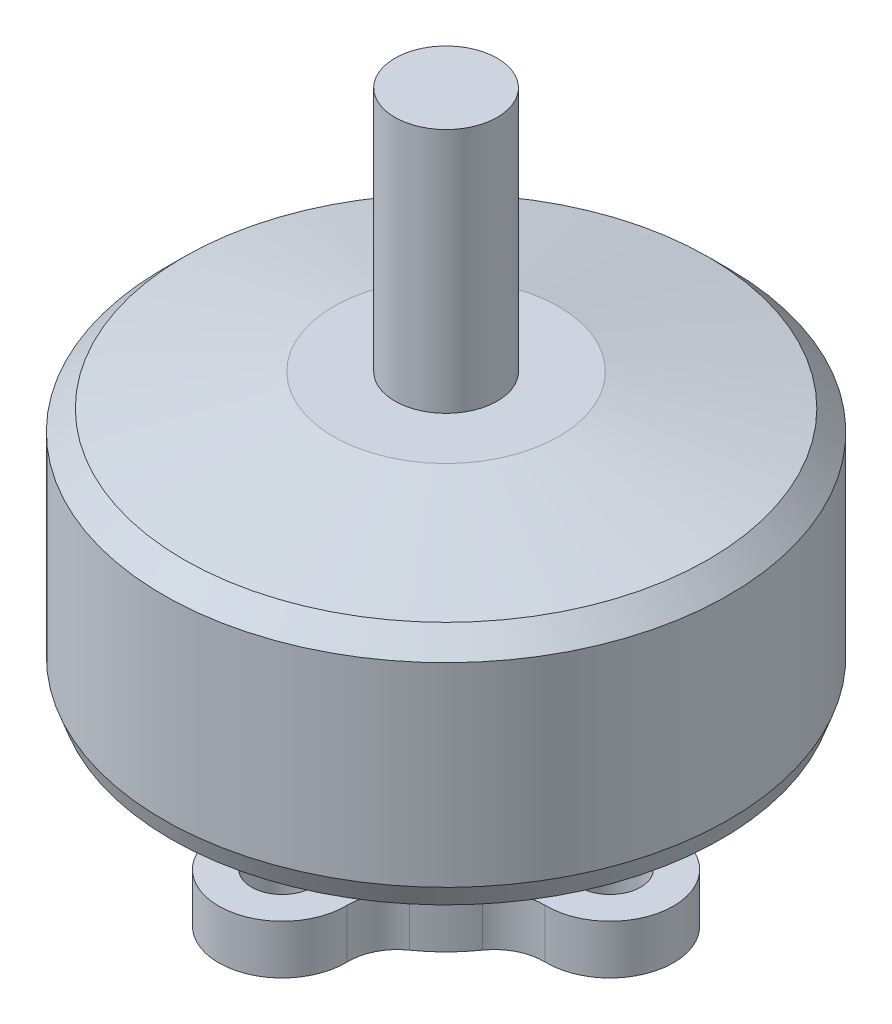
ISO-10303-21;
HEADER;
FILE_DESCRIPTION(('STEP AP214'),'2;1');
FILE_NAME('part.step','',(''),(''),'','','');
FILE_SCHEMA(('AUTOMOTIVE_DESIGN { 1 0 10303 214 1 1 1 1 }'));
ENDSEC;
DATA;
#1=APPLICATION_CONTEXT('core data for automotive mechanical design processes');
#2=APPLICATION_PROTOCOL_DEFINITION('international standard','automotive_design',2000,#1);
#3=PRODUCT_CONTEXT('',#1,'mechanical');
#4=PRODUCT('Part','Part','',(#3));
#5=PRODUCT_RELATED_PRODUCT_CATEGORY('part','',(#4));
#6=PRODUCT_DEFINITION_FORMATION('','',#4);
#7=PRODUCT_DEFINITION_CONTEXT('part definition',#1,'design');
#8=PRODUCT_DEFINITION('design','',#6,#7);
#9=PRODUCT_DEFINITION_SHAPE('','',#8);
#10=(LENGTH_UNIT() NAMED_UNIT(*) SI_UNIT(.MILLI.,.METRE.));
#11=(NAMED_UNIT(*) PLANE_ANGLE_UNIT() SI_UNIT($,.RADIAN.));
#12=(NAMED_UNIT(*) SI_UNIT($,.STERADIAN.) SOLID_ANGLE_UNIT());
#13=UNCERTAINTY_MEASURE_WITH_UNIT(LENGTH_MEASURE(1.E-05),#10,'distance_accuracy_value','');
#14=(GEOMETRIC_REPRESENTATION_CONTEXT(3) GLOBAL_UNCERTAINTY_ASSIGNED_CONTEXT((#13)) GLOBAL_UNIT_ASSIGNED_CONTEXT((#10,
#11,#12)) REPRESENTATION_CONTEXT('',''));
#15=CARTESIAN_POINT('',(0.,0.,0.));
#16=DIRECTION('',(0.,0.,1.));
#17=DIRECTION('',(1.,0.,0.));
#18=AXIS2_PLACEMENT_3D('',#15,#16,#17);
#19=CARTESIAN_POINT('',(0.,2.4,6.5));
#20=DIRECTION('',(0.,-1.,0.));
#21=DIRECTION('',(0.,0.,-1.));
#22=AXIS2_PLACEMENT_3D('',#19,#20,#21);
#23=PLANE('',#22);
#24=CARTESIAN_POINT('',(0.,2.4,0.));
#25=DIRECTION('',(0.,-1.,0.));
#26=DIRECTION('',(0.,0.,-1.));
#27=AXIS2_PLACEMENT_3D('',#24,#25,#26);
#28=CIRCLE('',#27,6.5);
#29=CARTESIAN_POINT('',(0.,2.4,6.5));
#30=VERTEX_POINT('',#29);
#31=CARTESIAN_POINT('',(-6.5,2.4,0.));
#32=VERTEX_POINT('',#31);
#33=EDGE_CURVE('E12',#30,#32,#28,.T.);
#34=ORIENTED_EDGE('',*,*,#33,.T.);
#35=CARTESIAN_POINT('',(-8.,2.4,0.));
#36=DIRECTION('',(0.,1.,0.));
#37=DIRECTION('',(0.,0.,1.));
#38=AXIS2_PLACEMENT_3D('',#35,#36,#37);
#39=CIRCLE('',#38,1.5);
#40=EDGE_CURVE('E71',#32,#32,#39,.T.);
#41=ORIENTED_EDGE('',*,*,#40,.F.);
#42=CARTESIAN_POINT('',(0.,2.4,-6.5));
#43=VERTEX_POINT('',#42);
#44=EDGE_CURVE('E65',#32,#43,#28,.T.);
#45=ORIENTED_EDGE('',*,*,#44,.T.);
#46=CARTESIAN_POINT('',(0.,2.4,-8.));
#47=DIRECTION('',(0.,1.,0.));
#48=DIRECTION('',(0.,0.,1.));
#49=AXIS2_PLACEMENT_3D('',#46,#47,#48);
#50=CIRCLE('',#49,1.5);
#51=EDGE_CURVE('E352',#43,#43,#50,.T.);
#52=ORIENTED_EDGE('',*,*,#51,.F.);
#53=CARTESIAN_POINT('',(6.5,2.4,0.));
#54=VERTEX_POINT('',#53);
#55=EDGE_CURVE('E343',#43,#54,#28,.T.);
#56=ORIENTED_EDGE('',*,*,#55,.T.);
#57=CARTESIAN_POINT('',(8.,2.4,0.));
#58=DIRECTION('',(0.,1.,0.));
#59=DIRECTION('',(0.,0.,1.));
#60=AXIS2_PLACEMENT_3D('',#57,#58,#59);
#61=CIRCLE('',#60,1.5);
#62=EDGE_CURVE('E351',#54,#54,#61,.T.);
#63=ORIENTED_EDGE('',*,*,#62,.F.);
#64=EDGE_CURVE('E66',#54,#30,#28,.T.);
#65=ORIENTED_EDGE('',*,*,#64,.T.);
#66=CARTESIAN_POINT('',(0.,2.4,8.));
#67=DIRECTION('',(0.,1.,0.));
#68=DIRECTION('',(0.,0.,1.));
#69=AXIS2_PLACEMENT_3D('',#66,#67,#68);
#70=CIRCLE('',#69,1.5);
#71=EDGE_CURVE('E247',#30,#30,#70,.T.);
#72=ORIENTED_EDGE('',*,*,#71,.F.);
#73=EDGE_LOOP('',(#34,#41,#45,#52,#56,#63,#65,#72));
#74=FACE_BOUND('',#73,.T.);
#75=CARTESIAN_POINT('',(0.,2.4,8.));
#76=DIRECTION('',(0.,1.,0.));
#77=DIRECTION('',(0.,0.,1.));
#78=AXIS2_PLACEMENT_3D('',#75,#76,#77);
#79=CIRCLE('',#78,3.1);
#80=CARTESIAN_POINT('',(-3.0991255798007,2.4,7.926375));
#81=VERTEX_POINT('',#80);
#82=CARTESIAN_POINT('',(3.0991255798007,2.4,7.926375));
#83=VERTEX_POINT('',#82);
#84=EDGE_CURVE('E188',#81,#83,#79,.T.);
#85=ORIENTED_EDGE('',*,*,#84,.T.);
#86=CARTESIAN_POINT('',(5.49844860932382,2.4,7.869375));
#87=DIRECTION('',(0.,1.,0.));
#88=DIRECTION('',(0.,0.,1.));
#89=AXIS2_PLACEMENT_3D('',#86,#87,#88);
#90=CIRCLE('',#89,2.4);
#91=CARTESIAN_POINT('',(4.12383645699286,2.4,5.90203125));
#92=VERTEX_POINT('',#91);
#93=EDGE_CURVE('E206',#92,#83,#90,.T.);
#94=ORIENTED_EDGE('',*,*,#93,.F.);
#95=CARTESIAN_POINT('',(0.,2.4,0.));
#96=DIRECTION('',(0.,1.,0.));
#97=DIRECTION('',(0.,0.,1.));
#98=AXIS2_PLACEMENT_3D('',#95,#96,#97);
#99=CIRCLE('',#98,7.2);
#100=CARTESIAN_POINT('',(5.90203125,2.4,4.12383645699286));
#101=VERTEX_POINT('',#100);
#102=EDGE_CURVE('E209',#92,#101,#99,.T.);
#103=ORIENTED_EDGE('',*,*,#102,.T.);
#104=CARTESIAN_POINT('',(7.869375,2.4,5.49844860932382));
#105=DIRECTION('',(0.,1.,0.));
#106=DIRECTION('',(0.,0.,1.));
#107=AXIS2_PLACEMENT_3D('',#104,#105,#106);
#108=CIRCLE('',#107,2.4);
#109=CARTESIAN_POINT('',(7.926375,2.4,3.0991255798007));
#110=VERTEX_POINT('',#109);
#111=EDGE_CURVE('E282',#110,#101,#108,.T.);
#112=ORIENTED_EDGE('',*,*,#111,.F.);
#113=CARTESIAN_POINT('',(8.,2.4,0.));
#114=DIRECTION('',(0.,1.,0.));
#115=DIRECTION('',(0.,0.,1.));
#116=AXIS2_PLACEMENT_3D('',#113,#114,#115);
#117=CIRCLE('',#116,3.1);
#118=CARTESIAN_POINT('',(7.926375,2.4,-3.0991255798007));
#119=VERTEX_POINT('',#118);
#120=EDGE_CURVE('E279',#110,#119,#117,.T.);
#121=ORIENTED_EDGE('',*,*,#120,.T.);
#122=CARTESIAN_POINT('',(7.86937499999999,2.4,-5.49844860932382));
#123=DIRECTION('',(0.,1.,0.));
#124=DIRECTION('',(0.,0.,1.));
#125=AXIS2_PLACEMENT_3D('',#122,#123,#124);
#126=CIRCLE('',#125,2.4);
#127=CARTESIAN_POINT('',(5.90203124999999,2.4,-4.12383645699286));
#128=VERTEX_POINT('',#127);
#129=EDGE_CURVE('E276',#128,#119,#126,.T.);
#130=ORIENTED_EDGE('',*,*,#129,.F.);
#131=CARTESIAN_POINT('',(0.,2.4,0.));
#132=DIRECTION('',(0.,1.,0.));
#133=DIRECTION('',(0.,0.,1.));
#134=AXIS2_PLACEMENT_3D('',#131,#132,#133);
#135=CIRCLE('',#134,7.2);
#136=CARTESIAN_POINT('',(4.12383645699286,2.4,-5.90203124999999));
#137=VERTEX_POINT('',#136);
#138=EDGE_CURVE('E273',#128,#137,#135,.T.);
#139=ORIENTED_EDGE('',*,*,#138,.T.);
#140=CARTESIAN_POINT('',(5.49844860932382,2.4,-7.869375));
#141=DIRECTION('',(0.,1.,0.));
#142=DIRECTION('',(0.,0.,1.));
#143=AXIS2_PLACEMENT_3D('',#140,#141,#142);
#144=CIRCLE('',#143,2.4);
#145=CARTESIAN_POINT('',(3.0991255798007,2.4,-7.926375));
#146=VERTEX_POINT('',#145);
#147=EDGE_CURVE('E270',#146,#137,#144,.T.);
#148=ORIENTED_EDGE('',*,*,#147,.F.);
#149=CARTESIAN_POINT('',(0.,2.4,-8.));
#150=DIRECTION('',(0.,1.,0.));
#151=DIRECTION('',(0.,0.,1.));
#152=AXIS2_PLACEMENT_3D('',#149,#150,#151);
#153=CIRCLE('',#152,3.1);
#154=CARTESIAN_POINT('',(-3.0991255798007,2.4,-7.926375));
#155=VERTEX_POINT('',#154);
#156=EDGE_CURVE('E267',#146,#155,#153,.T.);
#157=ORIENTED_EDGE('',*,*,#156,.T.);
#158=CARTESIAN_POINT('',(-5.49844860932382,2.4,-7.869375));
#159=DIRECTION('',(0.,1.,0.));
#160=DIRECTION('',(0.,0.,1.));
#161=AXIS2_PLACEMENT_3D('',#158,#159,#160);
#162=CIRCLE('',#161,2.4);
#163=CARTESIAN_POINT('',(-4.12383645699286,2.4,-5.90203125));
#164=VERTEX_POINT('',#163);
#165=EDGE_CURVE('E264',#155,#164,#162,.F.);
#166=ORIENTED_EDGE('',*,*,#165,.T.);
#167=CARTESIAN_POINT('',(0.,2.4,0.));
#168=DIRECTION('',(0.,1.,0.));
#169=DIRECTION('',(0.,0.,1.));
#170=AXIS2_PLACEMENT_3D('',#167,#168,#169);
#171=CIRCLE('',#170,7.2);
#172=CARTESIAN_POINT('',(-5.90203125,2.4,-4.12383645699286));
#173=VERTEX_POINT('',#172);
#174=EDGE_CURVE('E261',#164,#173,#171,.T.);
#175=ORIENTED_EDGE('',*,*,#174,.T.);
#176=CARTESIAN_POINT('',(-7.869375,2.4,-5.49844860932382));
#177=DIRECTION('',(0.,1.,0.));
#178=DIRECTION('',(0.,0.,1.));
#179=AXIS2_PLACEMENT_3D('',#176,#177,#178);
#180=CIRCLE('',#179,2.4);
#181=CARTESIAN_POINT('',(-7.926375,2.4,-3.0991255798007));
#182=VERTEX_POINT('',#181);
#183=EDGE_CURVE('E258',#182,#173,#180,.T.);
#184=ORIENTED_EDGE('',*,*,#183,.F.);
#185=CARTESIAN_POINT('',(-8.,2.4,0.));
#186=DIRECTION('',(0.,1.,0.));
#187=DIRECTION('',(0.,0.,1.));
#188=AXIS2_PLACEMENT_3D('',#185,#186,#187);
#189=CIRCLE('',#188,3.1);
#190=CARTESIAN_POINT('',(-7.926375,2.4,3.0991255798007));
#191=VERTEX_POINT('',#190);
#192=EDGE_CURVE('E255',#182,#191,#189,.T.);
#193=ORIENTED_EDGE('',*,*,#192,.T.);
#194=CARTESIAN_POINT('',(-7.869375,2.4,5.49844860932382));
#195=DIRECTION('',(0.,1.,0.));
#196=DIRECTION('',(0.,0.,1.));
#197=AXIS2_PLACEMENT_3D('',#194,#195,#196);
#198=CIRCLE('',#197,2.4);
#199=CARTESIAN_POINT('',(-5.90203125,2.4,4.12383645699286));
#200=VERTEX_POINT('',#199);
#201=EDGE_CURVE('E252',#191,#200,#198,.F.);
#202=ORIENTED_EDGE('',*,*,#201,.T.);
#203=CARTESIAN_POINT('',(0.,2.4,0.));
#204=DIRECTION('',(0.,1.,0.));
#205=DIRECTION('',(0.,0.,1.));
#206=AXIS2_PLACEMENT_3D('',#203,#204,#205);
#207=CIRCLE('',#206,7.2);
#208=CARTESIAN_POINT('',(-4.12383645699286,2.4,5.90203125));
#209=VERTEX_POINT('',#208);
#210=EDGE_CURVE('E249',#200,#209,#207,.T.);
#211=ORIENTED_EDGE('',*,*,#210,.T.);
#212=CARTESIAN_POINT('',(-5.49844860932382,2.4,7.869375));
#213=DIRECTION('',(0.,1.,0.));
#214=DIRECTION('',(0.,0.,1.));
#215=AXIS2_PLACEMENT_3D('',#212,#213,#214);
#216=CIRCLE('',#215,2.4);
#217=EDGE_CURVE('E246',#81,#209,#216,.T.);
#218=ORIENTED_EDGE('',*,*,#217,.F.);
#219=EDGE_LOOP('',(#85,#94,#103,#112,#121,#130,#139,#148,#157,#166,#175,#184,#193,#202,#211,#218));
#220=FACE_BOUND('',#219,.T.);
#221=ADVANCED_FACE('F57',(#74,#220),#23,.F.);
#222=CARTESIAN_POINT('',(0.,4.4,0.));
#223=DIRECTION('',(0.,-1.,0.));
#224=DIRECTION('',(0.,0.,-1.));
#225=AXIS2_PLACEMENT_3D('',#222,#223,#224);
#226=TOROIDAL_SURFACE('',#225,8.,2.5);
#227=ORIENTED_EDGE('',*,*,#33,.F.);
#228=ORIENTED_EDGE('',*,*,#64,.F.);
#229=ORIENTED_EDGE('',*,*,#55,.F.);
#230=ORIENTED_EDGE('',*,*,#44,.F.);
#231=EDGE_LOOP('',(#227,#228,#229,#230));
#232=FACE_BOUND('',#231,.T.);
#233=CARTESIAN_POINT('',(0.,4.4,0.));
#234=DIRECTION('',(0.,-1.,0.));
#235=DIRECTION('',(0.,0.,-1.));
#236=AXIS2_PLACEMENT_3D('',#233,#234,#235);
#237=CIRCLE('',#236,5.5);
#238=CARTESIAN_POINT('',(0.,4.4,-5.5));
#239=VERTEX_POINT('',#238);
#240=EDGE_CURVE('E339',#239,#239,#237,.T.);
#241=ORIENTED_EDGE('',*,*,#240,.T.);
#242=EDGE_LOOP('',(#241));
#243=FACE_BOUND('',#242,.T.);
#244=ADVANCED_FACE('F367',(#232,#243),#226,.F.);
#245=CARTESIAN_POINT('',(0.,0.,0.));
#246=DIRECTION('',(0.,-1.,0.));
#247=DIRECTION('',(0.,0.,-1.));
#248=AXIS2_PLACEMENT_3D('',#245,#246,#247);
#249=CYLINDRICAL_SURFACE('',#248,5.5);
#250=ORIENTED_EDGE('',*,*,#240,.F.);
#251=EDGE_LOOP('',(#250));
#252=FACE_BOUND('',#251,.T.);
#253=CARTESIAN_POINT('',(0.,6.4,0.));
#254=DIRECTION('',(0.,-1.,0.));
#255=DIRECTION('',(0.,0.,-1.));
#256=AXIS2_PLACEMENT_3D('',#253,#254,#255);
#257=CIRCLE('',#256,5.5);
#258=CARTESIAN_POINT('',(0.,6.4,-5.5));
#259=VERTEX_POINT('',#258);
#260=EDGE_CURVE('E337',#259,#259,#257,.T.);
#261=ORIENTED_EDGE('',*,*,#260,.T.);
#262=EDGE_LOOP('',(#261));
#263=FACE_BOUND('',#262,.T.);
#264=ADVANCED_FACE('F369',(#252,#263),#249,.T.);
#265=CARTESIAN_POINT('',(0.,6.4,13.4360297657338));
#266=DIRECTION('',(0.,1.,0.));
#267=DIRECTION('',(0.,0.,1.));
#268=AXIS2_PLACEMENT_3D('',#265,#266,#267);
#269=PLANE('',#268);
#270=ORIENTED_EDGE('',*,*,#260,.F.);
#271=EDGE_LOOP('',(#270));
#272=FACE_BOUND('',#271,.T.);
#273=CARTESIAN_POINT('',(0.,6.4,0.));
#274=DIRECTION('',(0.,-1.,0.));
#275=DIRECTION('',(0.,0.,-1.));
#276=AXIS2_PLACEMENT_3D('',#273,#274,#275);
#277=CIRCLE('',#276,13.4360297657338);
#278=CARTESIAN_POINT('',(0.,6.4,-13.4360297657338));
#279=VERTEX_POINT('',#278);
#280=EDGE_CURVE('E334',#279,#279,#277,.T.);
#281=ORIENTED_EDGE('',*,*,#280,.T.);
#282=EDGE_LOOP('',(#281));
#283=FACE_BOUND('',#282,.T.);
#284=ADVANCED_FACE('F375',(#272,#283),#269,.F.);
#285=CARTESIAN_POINT('',(0.,7.4,0.));
#286=DIRECTION('',(0.,1.,0.));
#287=DIRECTION('',(0.,0.,1.));
#288=AXIS2_PLACEMENT_3D('',#285,#286,#287);
#289=CONICAL_SURFACE('',#288,13.8,0.349065850398868);
#290=ORIENTED_EDGE('',*,*,#280,.F.);
#291=EDGE_LOOP('',(#290));
#292=FACE_BOUND('',#291,.T.);
#293=CARTESIAN_POINT('',(0.,7.4,0.));
#294=DIRECTION('',(0.,-1.,0.));
#295=DIRECTION('',(0.,0.,-1.));
#296=AXIS2_PLACEMENT_3D('',#293,#294,#295);
#297=CIRCLE('',#296,13.8);
#298=CARTESIAN_POINT('',(0.,7.4,-13.8));
#299=VERTEX_POINT('',#298);
#300=EDGE_CURVE('E331',#299,#299,#297,.T.);
#301=ORIENTED_EDGE('',*,*,#300,.T.);
#302=EDGE_LOOP('',(#301));
#303=FACE_BOUND('',#302,.T.);
#304=ADVANCED_FACE('F381',(#292,#303),#289,.T.);
#305=CARTESIAN_POINT('',(0.,0.,0.));
#306=DIRECTION('',(0.,-1.,0.));
#307=DIRECTION('',(0.,0.,-1.));
#308=AXIS2_PLACEMENT_3D('',#305,#306,#307);
#309=CYLINDRICAL_SURFACE('',#308,13.8);
#310=ORIENTED_EDGE('',*,*,#300,.F.);
#311=EDGE_LOOP('',(#310));
#312=FACE_BOUND('',#311,.T.);
#313=CARTESIAN_POINT('',(0.,16.8983370998088,0.));
#314=DIRECTION('',(0.,-1.,0.));
#315=DIRECTION('',(0.,0.,-1.));
#316=AXIS2_PLACEMENT_3D('',#313,#314,#315);
#317=CIRCLE('',#316,13.8);
#318=CARTESIAN_POINT('',(0.,16.8983370998088,-13.8));
#319=VERTEX_POINT('',#318);
#320=EDGE_CURVE('E328',#319,#319,#317,.T.);
#321=ORIENTED_EDGE('',*,*,#320,.T.);
#322=EDGE_LOOP('',(#321));
#323=FACE_BOUND('',#322,.T.);
#324=ADVANCED_FACE('F385',(#312,#323),#309,.T.);
#325=CARTESIAN_POINT('',(0.,17.8983370998088,0.));
#326=DIRECTION('',(0.,-1.,0.));
#327=DIRECTION('',(0.,0.,-1.));
#328=AXIS2_PLACEMENT_3D('',#325,#326,#327);
#329=CONICAL_SURFACE('',#328,12.8,0.785398163397442);
#330=ORIENTED_EDGE('',*,*,#320,.F.);
#331=EDGE_LOOP('',(#330));
#332=FACE_BOUND('',#331,.T.);
#333=CARTESIAN_POINT('',(0.,17.8983370998088,0.));
#334=DIRECTION('',(0.,-1.,0.));
#335=DIRECTION('',(0.,0.,-1.));
#336=AXIS2_PLACEMENT_3D('',#333,#334,#335);
#337=CIRCLE('',#336,12.8);
#338=CARTESIAN_POINT('',(0.,17.8983370998088,-12.8));
#339=VERTEX_POINT('',#338);
#340=EDGE_CURVE('E325',#339,#339,#337,.T.);
#341=ORIENTED_EDGE('',*,*,#340,.T.);
#342=EDGE_LOOP('',(#341));
#343=FACE_BOUND('',#342,.T.);
#344=ADVANCED_FACE('F389',(#332,#343),#329,.T.);
#345=CARTESIAN_POINT('',(0.,19.45,0.));
#346=DIRECTION('',(0.,-1.,0.));
#347=DIRECTION('',(0.,0.,-1.));
#348=AXIS2_PLACEMENT_3D('',#345,#346,#347);
#349=CONICAL_SURFACE('',#348,5.5,1.36135681655558);
#350=ORIENTED_EDGE('',*,*,#340,.F.);
#351=EDGE_LOOP('',(#350));
#352=FACE_BOUND('',#351,.T.);
#353=CARTESIAN_POINT('',(0.,19.45,0.));
#354=DIRECTION('',(0.,-1.,0.));
#355=DIRECTION('',(0.,0.,-1.));
#356=AXIS2_PLACEMENT_3D('',#353,#354,#355);
#357=CIRCLE('',#356,5.5);
#358=CARTESIAN_POINT('',(0.,19.45,-5.5));
#359=VERTEX_POINT('',#358);
#360=EDGE_CURVE('E322',#359,#359,#357,.T.);
#361=ORIENTED_EDGE('',*,*,#360,.T.);
#362=EDGE_LOOP('',(#361));
#363=FACE_BOUND('',#362,.T.);
#364=ADVANCED_FACE('F393',(#352,#363),#349,.T.);
#365=CARTESIAN_POINT('',(0.,19.45,5.5));
#366=DIRECTION('',(0.,-1.,0.));
#367=DIRECTION('',(0.,0.,-1.));
#368=AXIS2_PLACEMENT_3D('',#365,#366,#367);
#369=PLANE('',#368);
#370=ORIENTED_EDGE('',*,*,#360,.F.);
#371=EDGE_LOOP('',(#370));
#372=FACE_BOUND('',#371,.T.);
#373=CARTESIAN_POINT('',(0.,19.45,0.));
#374=DIRECTION('',(0.,-1.,0.));
#375=DIRECTION('',(0.,0.,-1.));
#376=AXIS2_PLACEMENT_3D('',#373,#374,#375);
#377=CIRCLE('',#376,2.5);
#378=CARTESIAN_POINT('',(0.,19.45,-2.5));
#379=VERTEX_POINT('',#378);
#380=EDGE_CURVE('E319',#379,#379,#377,.T.);
#381=ORIENTED_EDGE('',*,*,#380,.T.);
#382=EDGE_LOOP('',(#381));
#383=FACE_BOUND('',#382,.T.);
#384=ADVANCED_FACE('F397',(#372,#383),#369,.F.);
#385=CARTESIAN_POINT('',(0.,0.,0.));
#386=DIRECTION('',(0.,-1.,0.));
#387=DIRECTION('',(0.,0.,-1.));
#388=AXIS2_PLACEMENT_3D('',#385,#386,#387);
#389=CYLINDRICAL_SURFACE('',#388,2.5);
#390=ORIENTED_EDGE('',*,*,#380,.F.);
#391=EDGE_LOOP('',(#390));
#392=FACE_BOUND('',#391,.T.);
#393=CARTESIAN_POINT('',(0.,31.45,0.));
#394=DIRECTION('',(0.,-1.,0.));
#395=DIRECTION('',(0.,0.,-1.));
#396=AXIS2_PLACEMENT_3D('',#393,#394,#395);
#397=CIRCLE('',#396,2.5);
#398=CARTESIAN_POINT('',(0.,31.45,-2.5));
#399=VERTEX_POINT('',#398);
#400=EDGE_CURVE('E289',#399,#399,#397,.T.);
#401=ORIENTED_EDGE('',*,*,#400,.T.);
#402=EDGE_LOOP('',(#401));
#403=FACE_BOUND('',#402,.T.);
#404=ADVANCED_FACE('F401',(#392,#403),#389,.T.);
#405=CARTESIAN_POINT('',(0.,31.45,0.));
#406=DIRECTION('',(0.,-1.,0.));
#407=DIRECTION('',(0.,0.,-1.));
#408=AXIS2_PLACEMENT_3D('',#405,#406,#407);
#409=PLANE('',#408);
#410=ORIENTED_EDGE('',*,*,#400,.F.);
#411=EDGE_LOOP('',(#410));
#412=FACE_BOUND('',#411,.T.);
#413=ADVANCED_FACE('F405',(#412),#409,.F.);
#414=CARTESIAN_POINT('',(0.,0.,8.));
#415=DIRECTION('',(0.,1.,0.));
#416=DIRECTION('',(0.,0.,1.));
#417=AXIS2_PLACEMENT_3D('',#414,#415,#416);
#418=CYLINDRICAL_SURFACE('',#417,3.1);
#419=ORIENTED_EDGE('',*,*,#84,.F.);
#420=DIRECTION('',(0.,1.,0.));
#421=VECTOR('',#420,1.);
#422=CARTESIAN_POINT('',(-3.0991255798007,0.,7.926375));
#423=LINE('',#422,#421);
#424=CARTESIAN_POINT('',(-3.0991255798007,0.,7.926375));
#425=VERTEX_POINT('',#424);
#426=EDGE_CURVE('E181',#425,#81,#423,.T.);
#427=ORIENTED_EDGE('',*,*,#426,.F.);
#428=CARTESIAN_POINT('',(0.,0.,8.));
#429=DIRECTION('',(0.,1.,0.));
#430=DIRECTION('',(0.,0.,1.));
#431=AXIS2_PLACEMENT_3D('',#428,#429,#430);
#432=CIRCLE('',#431,3.1);
#433=CARTESIAN_POINT('',(3.0991255798007,0.,7.926375));
#434=VERTEX_POINT('',#433);
#435=EDGE_CURVE('E185',#425,#434,#432,.T.);
#436=ORIENTED_EDGE('',*,*,#435,.T.);
#437=DIRECTION('',(0.,1.,0.));
#438=VECTOR('',#437,1.);
#439=CARTESIAN_POINT('',(3.0991255798007,0.,7.926375));
#440=LINE('',#439,#438);
#441=EDGE_CURVE('E287',#434,#83,#440,.T.);
#442=ORIENTED_EDGE('',*,*,#441,.T.);
#443=EDGE_LOOP('',(#419,#427,#436,#442));
#444=FACE_BOUND('',#443,.T.);
#445=ADVANCED_FACE('F183',(#444),#418,.T.);
#446=CARTESIAN_POINT('',(5.49844860932382,0.,7.869375));
#447=DIRECTION('',(0.,1.,0.));
#448=DIRECTION('',(0.,0.,1.));
#449=AXIS2_PLACEMENT_3D('',#446,#447,#448);
#450=CYLINDRICAL_SURFACE('',#449,2.4);
#451=ORIENTED_EDGE('',*,*,#93,.T.);
#452=ORIENTED_EDGE('',*,*,#441,.F.);
#453=CARTESIAN_POINT('',(5.49844860932382,0.,7.869375));
#454=DIRECTION('',(0.,1.,0.));
#455=DIRECTION('',(0.,0.,1.));
#456=AXIS2_PLACEMENT_3D('',#453,#454,#455);
#457=CIRCLE('',#456,2.4);
#458=CARTESIAN_POINT('',(4.12383645699286,0.,5.90203125));
#459=VERTEX_POINT('',#458);
#460=EDGE_CURVE('E193',#459,#434,#457,.T.);
#461=ORIENTED_EDGE('',*,*,#460,.F.);
#462=DIRECTION('',(0.,1.,0.));
#463=VECTOR('',#462,1.);
#464=CARTESIAN_POINT('',(4.12383645699286,0.,5.90203125));
#465=LINE('',#464,#463);
#466=EDGE_CURVE('E290',#459,#92,#465,.T.);
#467=ORIENTED_EDGE('',*,*,#466,.T.);
#468=EDGE_LOOP('',(#451,#452,#461,#467));
#469=FACE_BOUND('',#468,.T.);
#470=ADVANCED_FACE('F412',(#469),#450,.F.);
#471=CARTESIAN_POINT('',(0.,0.,0.));
#472=DIRECTION('',(0.,1.,0.));
#473=DIRECTION('',(0.,0.,1.));
#474=AXIS2_PLACEMENT_3D('',#471,#472,#473);
#475=CYLINDRICAL_SURFACE('',#474,7.2);
#476=ORIENTED_EDGE('',*,*,#102,.F.);
#477=ORIENTED_EDGE('',*,*,#466,.F.);
#478=CARTESIAN_POINT('',(0.,0.,0.));
#479=DIRECTION('',(0.,1.,0.));
#480=DIRECTION('',(0.,0.,1.));
#481=AXIS2_PLACEMENT_3D('',#478,#479,#480);
#482=CIRCLE('',#481,7.2);
#483=CARTESIAN_POINT('',(5.90203125,0.,4.12383645699286));
#484=VERTEX_POINT('',#483);
#485=EDGE_CURVE('E242',#459,#484,#482,.T.);
#486=ORIENTED_EDGE('',*,*,#485,.T.);
#487=DIRECTION('',(0.,1.,0.));
#488=VECTOR('',#487,1.);
#489=CARTESIAN_POINT('',(5.90203125,0.,4.12383645699286));
#490=LINE('',#489,#488);
#491=EDGE_CURVE('E292',#484,#101,#490,.T.);
#492=ORIENTED_EDGE('',*,*,#491,.T.);
#493=EDGE_LOOP('',(#476,#477,#486,#492));
#494=FACE_BOUND('',#493,.T.);
#495=ADVANCED_FACE('F462',(#494),#475,.T.);
#496=CARTESIAN_POINT('',(7.869375,0.,5.49844860932382));
#497=DIRECTION('',(0.,1.,0.));
#498=DIRECTION('',(0.,0.,1.));
#499=AXIS2_PLACEMENT_3D('',#496,#497,#498);
#500=CYLINDRICAL_SURFACE('',#499,2.4);
#501=ORIENTED_EDGE('',*,*,#111,.T.);
#502=ORIENTED_EDGE('',*,*,#491,.F.);
#503=CARTESIAN_POINT('',(7.869375,0.,5.49844860932382));
#504=DIRECTION('',(0.,1.,0.));
#505=DIRECTION('',(0.,0.,1.));
#506=AXIS2_PLACEMENT_3D('',#503,#504,#505);
#507=CIRCLE('',#506,2.4);
#508=CARTESIAN_POINT('',(7.926375,0.,3.0991255798007));
#509=VERTEX_POINT('',#508);
#510=EDGE_CURVE('E239',#509,#484,#507,.T.);
#511=ORIENTED_EDGE('',*,*,#510,.F.);
#512=DIRECTION('',(0.,1.,0.));
#513=VECTOR('',#512,1.);
#514=CARTESIAN_POINT('',(7.926375,0.,3.0991255798007));
#515=LINE('',#514,#513);
#516=EDGE_CURVE('E294',#509,#110,#515,.T.);
#517=ORIENTED_EDGE('',*,*,#516,.T.);
#518=EDGE_LOOP('',(#501,#502,#511,#517));
#519=FACE_BOUND('',#518,.T.);
#520=ADVANCED_FACE('F458',(#519),#500,.F.);
#521=CARTESIAN_POINT('',(8.,0.,0.));
#522=DIRECTION('',(0.,1.,0.));
#523=DIRECTION('',(0.,0.,1.));
#524=AXIS2_PLACEMENT_3D('',#521,#522,#523);
#525=CYLINDRICAL_SURFACE('',#524,3.1);
#526=ORIENTED_EDGE('',*,*,#120,.F.);
#527=ORIENTED_EDGE('',*,*,#516,.F.);
#528=CARTESIAN_POINT('',(8.,0.,0.));
#529=DIRECTION('',(0.,1.,0.));
#530=DIRECTION('',(0.,0.,1.));
#531=AXIS2_PLACEMENT_3D('',#528,#529,#530);
#532=CIRCLE('',#531,3.1);
#533=CARTESIAN_POINT('',(7.926375,0.,-3.0991255798007));
#534=VERTEX_POINT('',#533);
#535=EDGE_CURVE('E237',#509,#534,#532,.T.);
#536=ORIENTED_EDGE('',*,*,#535,.T.);
#537=DIRECTION('',(0.,1.,0.));
#538=VECTOR('',#537,1.);
#539=CARTESIAN_POINT('',(7.926375,0.,-3.0991255798007));
#540=LINE('',#539,#538);
#541=EDGE_CURVE('E296',#534,#119,#540,.T.);
#542=ORIENTED_EDGE('',*,*,#541,.T.);
#543=EDGE_LOOP('',(#526,#527,#536,#542));
#544=FACE_BOUND('',#543,.T.);
#545=ADVANCED_FACE('F454',(#544),#525,.T.);
#546=CARTESIAN_POINT('',(7.86937499999999,0.,-5.49844860932382));
#547=DIRECTION('',(0.,1.,0.));
#548=DIRECTION('',(0.,0.,1.));
#549=AXIS2_PLACEMENT_3D('',#546,#547,#548);
#550=CYLINDRICAL_SURFACE('',#549,2.4);
#551=ORIENTED_EDGE('',*,*,#129,.T.);
#552=ORIENTED_EDGE('',*,*,#541,.F.);
#553=CARTESIAN_POINT('',(7.86937499999999,0.,-5.49844860932382));
#554=DIRECTION('',(0.,1.,0.));
#555=DIRECTION('',(0.,0.,1.));
#556=AXIS2_PLACEMENT_3D('',#553,#554,#555);
#557=CIRCLE('',#556,2.4);
#558=CARTESIAN_POINT('',(5.90203124999999,0.,-4.12383645699286));
#559=VERTEX_POINT('',#558);
#560=EDGE_CURVE('E234',#559,#534,#557,.T.);
#561=ORIENTED_EDGE('',*,*,#560,.F.);
#562=DIRECTION('',(0.,1.,0.));
#563=VECTOR('',#562,1.);
#564=CARTESIAN_POINT('',(5.90203124999999,0.,-4.12383645699286));
#565=LINE('',#564,#563);
#566=EDGE_CURVE('E298',#559,#128,#565,.T.);
#567=ORIENTED_EDGE('',*,*,#566,.T.);
#568=EDGE_LOOP('',(#551,#552,#561,#567));
#569=FACE_BOUND('',#568,.T.);
#570=ADVANCED_FACE('F450',(#569),#550,.F.);
#571=CARTESIAN_POINT('',(0.,0.,0.));
#572=DIRECTION('',(0.,1.,0.));
#573=DIRECTION('',(0.,0.,1.));
#574=AXIS2_PLACEMENT_3D('',#571,#572,#573);
#575=CYLINDRICAL_SURFACE('',#574,7.2);
#576=ORIENTED_EDGE('',*,*,#138,.F.);
#577=ORIENTED_EDGE('',*,*,#566,.F.);
#578=CARTESIAN_POINT('',(0.,0.,0.));
#579=DIRECTION('',(0.,1.,0.));
#580=DIRECTION('',(0.,0.,1.));
#581=AXIS2_PLACEMENT_3D('',#578,#579,#580);
#582=CIRCLE('',#581,7.2);
#583=CARTESIAN_POINT('',(4.12383645699286,0.,-5.90203124999999));
#584=VERTEX_POINT('',#583);
#585=EDGE_CURVE('E232',#559,#584,#582,.T.);
#586=ORIENTED_EDGE('',*,*,#585,.T.);
#587=DIRECTION('',(0.,1.,0.));
#588=VECTOR('',#587,1.);
#589=CARTESIAN_POINT('',(4.12383645699286,0.,-5.90203124999999));
#590=LINE('',#589,#588);
#591=EDGE_CURVE('E300',#584,#137,#590,.T.);
#592=ORIENTED_EDGE('',*,*,#591,.T.);
#593=EDGE_LOOP('',(#576,#577,#586,#592));
#594=FACE_BOUND('',#593,.T.);
#595=ADVANCED_FACE('F446',(#594),#575,.T.);
#596=CARTESIAN_POINT('',(5.49844860932382,0.,-7.869375));
#597=DIRECTION('',(0.,1.,0.));
#598=DIRECTION('',(0.,0.,1.));
#599=AXIS2_PLACEMENT_3D('',#596,#597,#598);
#600=CYLINDRICAL_SURFACE('',#599,2.4);
#601=ORIENTED_EDGE('',*,*,#147,.T.);
#602=ORIENTED_EDGE('',*,*,#591,.F.);
#603=CARTESIAN_POINT('',(5.49844860932382,0.,-7.869375));
#604=DIRECTION('',(0.,1.,0.));
#605=DIRECTION('',(0.,0.,1.));
#606=AXIS2_PLACEMENT_3D('',#603,#604,#605);
#607=CIRCLE('',#606,2.4);
#608=CARTESIAN_POINT('',(3.0991255798007,0.,-7.926375));
#609=VERTEX_POINT('',#608);
#610=EDGE_CURVE('E229',#609,#584,#607,.T.);
#611=ORIENTED_EDGE('',*,*,#610,.F.);
#612=DIRECTION('',(0.,1.,0.));
#613=VECTOR('',#612,1.);
#614=CARTESIAN_POINT('',(3.0991255798007,0.,-7.926375));
#615=LINE('',#614,#613);
#616=EDGE_CURVE('E302',#609,#146,#615,.T.);
#617=ORIENTED_EDGE('',*,*,#616,.T.);
#618=EDGE_LOOP('',(#601,#602,#611,#617));
#619=FACE_BOUND('',#618,.T.);
#620=ADVANCED_FACE('F442',(#619),#600,.F.);
#621=CARTESIAN_POINT('',(0.,0.,-8.));
#622=DIRECTION('',(0.,1.,0.));
#623=DIRECTION('',(0.,0.,1.));
#624=AXIS2_PLACEMENT_3D('',#621,#622,#623);
#625=CYLINDRICAL_SURFACE('',#624,3.1);
#626=ORIENTED_EDGE('',*,*,#156,.F.);
#627=ORIENTED_EDGE('',*,*,#616,.F.);
#628=CARTESIAN_POINT('',(0.,0.,-8.));
#629=DIRECTION('',(0.,1.,0.));
#630=DIRECTION('',(0.,0.,1.));
#631=AXIS2_PLACEMENT_3D('',#628,#629,#630);
#632=CIRCLE('',#631,3.1);
#633=CARTESIAN_POINT('',(-3.0991255798007,0.,-7.926375));
#634=VERTEX_POINT('',#633);
#635=EDGE_CURVE('E227',#609,#634,#632,.T.);
#636=ORIENTED_EDGE('',*,*,#635,.T.);
#637=DIRECTION('',(0.,1.,0.));
#638=VECTOR('',#637,1.);
#639=CARTESIAN_POINT('',(-3.0991255798007,0.,-7.926375));
#640=LINE('',#639,#638);
#641=EDGE_CURVE('E304',#634,#155,#640,.T.);
#642=ORIENTED_EDGE('',*,*,#641,.T.);
#643=EDGE_LOOP('',(#626,#627,#636,#642));
#644=FACE_BOUND('',#643,.T.);
#645=ADVANCED_FACE('F438',(#644),#625,.T.);
#646=CARTESIAN_POINT('',(-5.49844860932382,0.,-7.869375));
#647=DIRECTION('',(0.,1.,0.));
#648=DIRECTION('',(0.,0.,1.));
#649=AXIS2_PLACEMENT_3D('',#646,#647,#648);
#650=CYLINDRICAL_SURFACE('',#649,2.4);
#651=ORIENTED_EDGE('',*,*,#165,.F.);
#652=ORIENTED_EDGE('',*,*,#641,.F.);
#653=CARTESIAN_POINT('',(-5.49844860932382,0.,-7.869375));
#654=DIRECTION('',(0.,1.,0.));
#655=DIRECTION('',(0.,0.,1.));
#656=AXIS2_PLACEMENT_3D('',#653,#654,#655);
#657=CIRCLE('',#656,2.4);
#658=CARTESIAN_POINT('',(-4.12383645699286,0.,-5.90203125));
#659=VERTEX_POINT('',#658);
#660=EDGE_CURVE('E225',#634,#659,#657,.F.);
#661=ORIENTED_EDGE('',*,*,#660,.T.);
#662=DIRECTION('',(0.,1.,0.));
#663=VECTOR('',#662,1.);
#664=CARTESIAN_POINT('',(-4.12383645699286,0.,-5.90203125));
#665=LINE('',#664,#663);
#666=EDGE_CURVE('E306',#659,#164,#665,.T.);
#667=ORIENTED_EDGE('',*,*,#666,.T.);
#668=EDGE_LOOP('',(#651,#652,#661,#667));
#669=FACE_BOUND('',#668,.T.);
#670=ADVANCED_FACE('F434',(#669),#650,.F.);
#671=CARTESIAN_POINT('',(0.,0.,0.));
#672=DIRECTION('',(0.,1.,0.));
#673=DIRECTION('',(0.,0.,1.));
#674=AXIS2_PLACEMENT_3D('',#671,#672,#673);
#675=CYLINDRICAL_SURFACE('',#674,7.2);
#676=ORIENTED_EDGE('',*,*,#174,.F.);
#677=ORIENTED_EDGE('',*,*,#666,.F.);
#678=CARTESIAN_POINT('',(0.,0.,0.));
#679=DIRECTION('',(0.,1.,0.));
#680=DIRECTION('',(0.,0.,1.));
#681=AXIS2_PLACEMENT_3D('',#678,#679,#680);
#682=CIRCLE('',#681,7.2);
#683=CARTESIAN_POINT('',(-5.90203125,0.,-4.12383645699286));
#684=VERTEX_POINT('',#683);
#685=EDGE_CURVE('E223',#659,#684,#682,.T.);
#686=ORIENTED_EDGE('',*,*,#685,.T.);
#687=DIRECTION('',(0.,1.,0.));
#688=VECTOR('',#687,1.);
#689=CARTESIAN_POINT('',(-5.90203125,0.,-4.12383645699286));
#690=LINE('',#689,#688);
#691=EDGE_CURVE('E308',#684,#173,#690,.T.);
#692=ORIENTED_EDGE('',*,*,#691,.T.);
#693=EDGE_LOOP('',(#676,#677,#686,#692));
#694=FACE_BOUND('',#693,.T.);
#695=ADVANCED_FACE('F430',(#694),#675,.T.);
#696=CARTESIAN_POINT('',(-7.869375,0.,-5.49844860932382));
#697=DIRECTION('',(0.,1.,0.));
#698=DIRECTION('',(0.,0.,1.));
#699=AXIS2_PLACEMENT_3D('',#696,#697,#698);
#700=CYLINDRICAL_SURFACE('',#699,2.4);
#701=ORIENTED_EDGE('',*,*,#183,.T.);
#702=ORIENTED_EDGE('',*,*,#691,.F.);
#703=CARTESIAN_POINT('',(-7.869375,0.,-5.49844860932382));
#704=DIRECTION('',(0.,1.,0.));
#705=DIRECTION('',(0.,0.,1.));
#706=AXIS2_PLACEMENT_3D('',#703,#704,#705);
#707=CIRCLE('',#706,2.4);
#708=CARTESIAN_POINT('',(-7.926375,0.,-3.0991255798007));
#709=VERTEX_POINT('',#708);
#710=EDGE_CURVE('E220',#709,#684,#707,.T.);
#711=ORIENTED_EDGE('',*,*,#710,.F.);
#712=DIRECTION('',(0.,1.,0.));
#713=VECTOR('',#712,1.);
#714=CARTESIAN_POINT('',(-7.926375,0.,-3.0991255798007));
#715=LINE('',#714,#713);
#716=EDGE_CURVE('E310',#709,#182,#715,.T.);
#717=ORIENTED_EDGE('',*,*,#716,.T.);
#718=EDGE_LOOP('',(#701,#702,#711,#717));
#719=FACE_BOUND('',#718,.T.);
#720=ADVANCED_FACE('F426',(#719),#700,.F.);
#721=CARTESIAN_POINT('',(-8.,0.,0.));
#722=DIRECTION('',(0.,1.,0.));
#723=DIRECTION('',(0.,0.,1.));
#724=AXIS2_PLACEMENT_3D('',#721,#722,#723);
#725=CYLINDRICAL_SURFACE('',#724,3.1);
#726=ORIENTED_EDGE('',*,*,#192,.F.);
#727=ORIENTED_EDGE('',*,*,#716,.F.);
#728=CARTESIAN_POINT('',(-8.,0.,0.));
#729=DIRECTION('',(0.,1.,0.));
#730=DIRECTION('',(0.,0.,1.));
#731=AXIS2_PLACEMENT_3D('',#728,#729,#730);
#732=CIRCLE('',#731,3.1);
#733=CARTESIAN_POINT('',(-7.926375,0.,3.0991255798007));
#734=VERTEX_POINT('',#733);
#735=EDGE_CURVE('E218',#709,#734,#732,.T.);
#736=ORIENTED_EDGE('',*,*,#735,.T.);
#737=DIRECTION('',(0.,1.,0.));
#738=VECTOR('',#737,1.);
#739=CARTESIAN_POINT('',(-7.926375,0.,3.0991255798007));
#740=LINE('',#739,#738);
#741=EDGE_CURVE('E312',#734,#191,#740,.T.);
#742=ORIENTED_EDGE('',*,*,#741,.T.);
#743=EDGE_LOOP('',(#726,#727,#736,#742));
#744=FACE_BOUND('',#743,.T.);
#745=ADVANCED_FACE('F422',(#744),#725,.T.);
#746=CARTESIAN_POINT('',(-7.869375,0.,5.49844860932382));
#747=DIRECTION('',(0.,1.,0.));
#748=DIRECTION('',(0.,0.,1.));
#749=AXIS2_PLACEMENT_3D('',#746,#747,#748);
#750=CYLINDRICAL_SURFACE('',#749,2.4);
#751=ORIENTED_EDGE('',*,*,#201,.F.);
#752=ORIENTED_EDGE('',*,*,#741,.F.);
#753=CARTESIAN_POINT('',(-7.869375,0.,5.49844860932382));
#754=DIRECTION('',(0.,1.,0.));
#755=DIRECTION('',(0.,0.,1.));
#756=AXIS2_PLACEMENT_3D('',#753,#754,#755);
#757=CIRCLE('',#756,2.4);
#758=CARTESIAN_POINT('',(-5.90203125,0.,4.12383645699286));
#759=VERTEX_POINT('',#758);
#760=EDGE_CURVE('E216',#734,#759,#757,.F.);
#761=ORIENTED_EDGE('',*,*,#760,.T.);
#762=DIRECTION('',(0.,1.,0.));
#763=VECTOR('',#762,1.);
#764=CARTESIAN_POINT('',(-5.90203125,0.,4.12383645699286));
#765=LINE('',#764,#763);
#766=EDGE_CURVE('E314',#759,#200,#765,.T.);
#767=ORIENTED_EDGE('',*,*,#766,.T.);
#768=EDGE_LOOP('',(#751,#752,#761,#767));
#769=FACE_BOUND('',#768,.T.);
#770=ADVANCED_FACE('F418',(#769),#750,.F.);
#771=CARTESIAN_POINT('',(0.,0.,0.));
#772=DIRECTION('',(0.,1.,0.));
#773=DIRECTION('',(0.,0.,1.));
#774=AXIS2_PLACEMENT_3D('',#771,#772,#773);
#775=CYLINDRICAL_SURFACE('',#774,7.2);
#776=ORIENTED_EDGE('',*,*,#210,.F.);
#777=ORIENTED_EDGE('',*,*,#766,.F.);
#778=CARTESIAN_POINT('',(0.,0.,0.));
#779=DIRECTION('',(0.,1.,0.));
#780=DIRECTION('',(0.,0.,1.));
#781=AXIS2_PLACEMENT_3D('',#778,#779,#780);
#782=CIRCLE('',#781,7.2);
#783=CARTESIAN_POINT('',(-4.12383645699286,0.,5.90203125));
#784=VERTEX_POINT('',#783);
#785=EDGE_CURVE('E201',#759,#784,#782,.T.);
#786=ORIENTED_EDGE('',*,*,#785,.T.);
#787=DIRECTION('',(0.,1.,0.));
#788=VECTOR('',#787,1.);
#789=CARTESIAN_POINT('',(-4.12383645699286,0.,5.90203125));
#790=LINE('',#789,#788);
#791=EDGE_CURVE('E192',#784,#209,#790,.T.);
#792=ORIENTED_EDGE('',*,*,#791,.T.);
#793=EDGE_LOOP('',(#776,#777,#786,#792));
#794=FACE_BOUND('',#793,.T.);
#795=ADVANCED_FACE('F415',(#794),#775,.T.);
#796=CARTESIAN_POINT('',(-5.49844860932382,0.,7.869375));
#797=DIRECTION('',(0.,1.,0.));
#798=DIRECTION('',(0.,0.,1.));
#799=AXIS2_PLACEMENT_3D('',#796,#797,#798);
#800=CYLINDRICAL_SURFACE('',#799,2.4);
#801=ORIENTED_EDGE('',*,*,#217,.T.);
#802=ORIENTED_EDGE('',*,*,#791,.F.);
#803=CARTESIAN_POINT('',(-5.49844860932382,0.,7.869375));
#804=DIRECTION('',(0.,1.,0.));
#805=DIRECTION('',(0.,0.,1.));
#806=AXIS2_PLACEMENT_3D('',#803,#804,#805);
#807=CIRCLE('',#806,2.4);
#808=EDGE_CURVE('E196',#425,#784,#807,.T.);
#809=ORIENTED_EDGE('',*,*,#808,.F.);
#810=ORIENTED_EDGE('',*,*,#426,.T.);
#811=EDGE_LOOP('',(#801,#802,#809,#810));
#812=FACE_BOUND('',#811,.T.);
#813=ADVANCED_FACE('F197',(#812),#800,.F.);
#814=CARTESIAN_POINT('',(0.,0.,12.));
#815=DIRECTION('',(0.,1.,0.));
#816=DIRECTION('',(0.,0.,1.));
#817=AXIS2_PLACEMENT_3D('',#814,#815,#816);
#818=PLANE('',#817);
#819=CARTESIAN_POINT('',(-8.,0.,0.));
#820=DIRECTION('',(0.,1.,0.));
#821=DIRECTION('',(0.,0.,1.));
#822=AXIS2_PLACEMENT_3D('',#819,#820,#821);
#823=CIRCLE('',#822,1.5);
#824=CARTESIAN_POINT('',(-8.,0.,1.5));
#825=VERTEX_POINT('',#824);
#826=EDGE_CURVE('E487',#825,#825,#823,.T.);
#827=ORIENTED_EDGE('',*,*,#826,.T.);
#828=EDGE_LOOP('',(#827));
#829=FACE_BOUND('',#828,.T.);
#830=CARTESIAN_POINT('',(0.,0.,-8.));
#831=DIRECTION('',(0.,1.,0.));
#832=DIRECTION('',(0.,0.,1.));
#833=AXIS2_PLACEMENT_3D('',#830,#831,#832);
#834=CIRCLE('',#833,1.5);
#835=CARTESIAN_POINT('',(0.,0.,-6.5));
#836=VERTEX_POINT('',#835);
#837=EDGE_CURVE('E362',#836,#836,#834,.T.);
#838=ORIENTED_EDGE('',*,*,#837,.T.);
#839=EDGE_LOOP('',(#838));
#840=FACE_BOUND('',#839,.T.);
#841=CARTESIAN_POINT('',(8.,0.,0.));
#842=DIRECTION('',(0.,1.,0.));
#843=DIRECTION('',(0.,0.,1.));
#844=AXIS2_PLACEMENT_3D('',#841,#842,#843);
#845=CIRCLE('',#844,1.5);
#846=CARTESIAN_POINT('',(8.,0.,1.5));
#847=VERTEX_POINT('',#846);
#848=EDGE_CURVE('E356',#847,#847,#845,.T.);
#849=ORIENTED_EDGE('',*,*,#848,.T.);
#850=EDGE_LOOP('',(#849));
#851=FACE_BOUND('',#850,.T.);
#852=CARTESIAN_POINT('',(0.,0.,8.));
#853=DIRECTION('',(0.,1.,0.));
#854=DIRECTION('',(0.,0.,1.));
#855=AXIS2_PLACEMENT_3D('',#852,#853,#854);
#856=CIRCLE('',#855,1.5);
#857=CARTESIAN_POINT('',(0.,0.,9.5));
#858=VERTEX_POINT('',#857);
#859=EDGE_CURVE('E212',#858,#858,#856,.T.);
#860=ORIENTED_EDGE('',*,*,#859,.T.);
#861=EDGE_LOOP('',(#860));
#862=FACE_BOUND('',#861,.T.);
#863=ORIENTED_EDGE('',*,*,#435,.F.);
#864=ORIENTED_EDGE('',*,*,#808,.T.);
#865=ORIENTED_EDGE('',*,*,#785,.F.);
#866=ORIENTED_EDGE('',*,*,#760,.F.);
#867=ORIENTED_EDGE('',*,*,#735,.F.);
#868=ORIENTED_EDGE('',*,*,#710,.T.);
#869=ORIENTED_EDGE('',*,*,#685,.F.);
#870=ORIENTED_EDGE('',*,*,#660,.F.);
#871=ORIENTED_EDGE('',*,*,#635,.F.);
#872=ORIENTED_EDGE('',*,*,#610,.T.);
#873=ORIENTED_EDGE('',*,*,#585,.F.);
#874=ORIENTED_EDGE('',*,*,#560,.T.);
#875=ORIENTED_EDGE('',*,*,#535,.F.);
#876=ORIENTED_EDGE('',*,*,#510,.T.);
#877=ORIENTED_EDGE('',*,*,#485,.F.);
#878=ORIENTED_EDGE('',*,*,#460,.T.);
#879=EDGE_LOOP('',(#863,#864,#865,#866,#867,#868,#869,#870,#871,#872,#873,#874,#875,#876,#877,#878));
#880=FACE_BOUND('',#879,.T.);
#881=ADVANCED_FACE('F59',(#829,#840,#851,#862,#880),#818,.F.);
#882=CARTESIAN_POINT('',(0.,0.,8.));
#883=DIRECTION('',(0.,1.,0.));
#884=DIRECTION('',(0.,0.,1.));
#885=AXIS2_PLACEMENT_3D('',#882,#883,#884);
#886=CYLINDRICAL_SURFACE('',#885,1.5);
#887=ORIENTED_EDGE('',*,*,#859,.F.);
#888=EDGE_LOOP('',(#887));
#889=FACE_BOUND('',#888,.T.);
#890=ORIENTED_EDGE('',*,*,#71,.T.);
#891=EDGE_LOOP('',(#890));
#892=FACE_BOUND('',#891,.T.);
#893=ADVANCED_FACE('F365',(#889,#892),#886,.F.);
#894=CARTESIAN_POINT('',(8.,0.,0.));
#895=DIRECTION('',(0.,1.,0.));
#896=DIRECTION('',(0.,0.,1.));
#897=AXIS2_PLACEMENT_3D('',#894,#895,#896);
#898=CYLINDRICAL_SURFACE('',#897,1.5);
#899=ORIENTED_EDGE('',*,*,#848,.F.);
#900=EDGE_LOOP('',(#899));
#901=FACE_BOUND('',#900,.T.);
#902=ORIENTED_EDGE('',*,*,#62,.T.);
#903=EDGE_LOOP('',(#902));
#904=FACE_BOUND('',#903,.T.);
#905=ADVANCED_FACE('F355',(#901,#904),#898,.F.);
#906=CARTESIAN_POINT('',(0.,0.,-8.));
#907=DIRECTION('',(0.,1.,0.));
#908=DIRECTION('',(0.,0.,1.));
#909=AXIS2_PLACEMENT_3D('',#906,#907,#908);
#910=CYLINDRICAL_SURFACE('',#909,1.5);
#911=ORIENTED_EDGE('',*,*,#837,.F.);
#912=EDGE_LOOP('',(#911));
#913=FACE_BOUND('',#912,.T.);
#914=ORIENTED_EDGE('',*,*,#51,.T.);
#915=EDGE_LOOP('',(#914));
#916=FACE_BOUND('',#915,.T.);
#917=ADVANCED_FACE('F475',(#913,#916),#910,.F.);
#918=CARTESIAN_POINT('',(-8.,0.,0.));
#919=DIRECTION('',(0.,1.,0.));
#920=DIRECTION('',(0.,0.,1.));
#921=AXIS2_PLACEMENT_3D('',#918,#919,#920);
#922=CYLINDRICAL_SURFACE('',#921,1.5);
#923=ORIENTED_EDGE('',*,*,#826,.F.);
#924=EDGE_LOOP('',(#923));
#925=FACE_BOUND('',#924,.T.);
#926=ORIENTED_EDGE('',*,*,#40,.T.);
#927=EDGE_LOOP('',(#926));
#928=FACE_BOUND('',#927,.T.);
#929=ADVANCED_FACE('F479',(#925,#928),#922,.F.);
#930=CLOSED_SHELL('',(#221,#244,#264,#284,#304,#324,#344,#364,#384,#404,#413,#445,#470,#495,
#520,#545,#570,#595,#620,#645,#670,#695,#720,#745,#770,#795,#813,#881,#893,#905,#917,#929));
#931=MANIFOLD_SOLID_BREP('B2',#930);
#932=ADVANCED_BREP_SHAPE_REPRESENTATION('',(#18,#931),#14);
#933=SHAPE_DEFINITION_REPRESENTATION(#9,#932);
ENDSEC;
END-ISO-10303-21;
